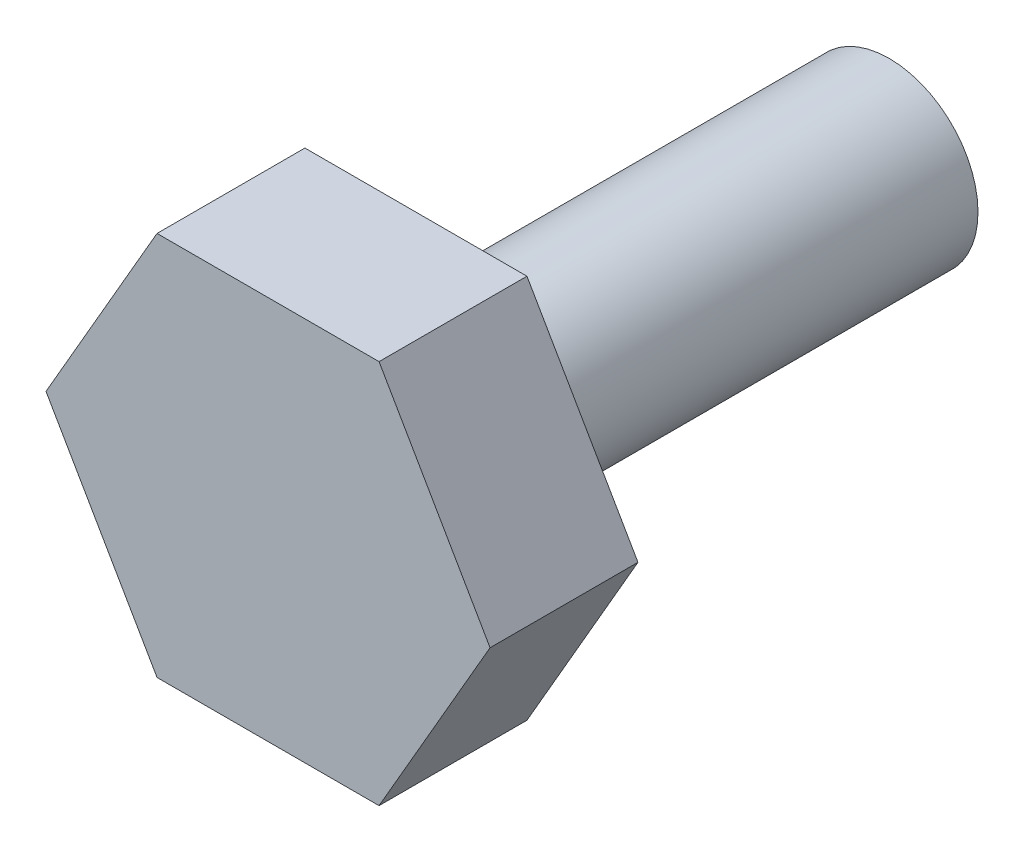
ISO-10303-21;
HEADER;
FILE_DESCRIPTION(('STEP AP214'),'2;1');
FILE_NAME('part.step','',(''),(''),'','','');
FILE_SCHEMA(('AUTOMOTIVE_DESIGN { 1 0 10303 214 1 1 1 1 }'));
ENDSEC;
DATA;
#1=APPLICATION_CONTEXT('core data for automotive mechanical design processes');
#2=APPLICATION_PROTOCOL_DEFINITION('international standard','automotive_design',2000,#1);
#3=PRODUCT_CONTEXT('',#1,'mechanical');
#4=PRODUCT('Part','Part','',(#3));
#5=PRODUCT_RELATED_PRODUCT_CATEGORY('part','',(#4));
#6=PRODUCT_DEFINITION_FORMATION('','',#4);
#7=PRODUCT_DEFINITION_CONTEXT('part definition',#1,'design');
#8=PRODUCT_DEFINITION('design','',#6,#7);
#9=PRODUCT_DEFINITION_SHAPE('','',#8);
#10=(LENGTH_UNIT() NAMED_UNIT(*) SI_UNIT(.MILLI.,.METRE.));
#11=(NAMED_UNIT(*) PLANE_ANGLE_UNIT() SI_UNIT($,.RADIAN.));
#12=(NAMED_UNIT(*) SI_UNIT($,.STERADIAN.) SOLID_ANGLE_UNIT());
#13=UNCERTAINTY_MEASURE_WITH_UNIT(LENGTH_MEASURE(1.E-05),#10,'distance_accuracy_value','');
#14=(GEOMETRIC_REPRESENTATION_CONTEXT(3) GLOBAL_UNCERTAINTY_ASSIGNED_CONTEXT((#13)) GLOBAL_UNIT_ASSIGNED_CONTEXT((#10,
#11,#12)) REPRESENTATION_CONTEXT('',''));
#15=CARTESIAN_POINT('',(0.,0.,0.));
#16=DIRECTION('',(0.,0.,1.));
#17=DIRECTION('',(1.,0.,0.));
#18=AXIS2_PLACEMENT_3D('',#15,#16,#17);
#19=CARTESIAN_POINT('',(-4.76602647216036,-8.255,6.35));
#20=DIRECTION('',(0.,1.,0.));
#21=DIRECTION('',(-1.,0.,0.));
#22=AXIS2_PLACEMENT_3D('',#19,#20,#21);
#23=PLANE('',#22);
#24=DIRECTION('',(1.,0.,0.));
#25=VECTOR('',#24,1.);
#26=CARTESIAN_POINT('',(-4.76602647216036,-8.255,0.));
#27=LINE('',#26,#25);
#28=CARTESIAN_POINT('',(-4.76602647216036,-8.255,0.));
#29=VERTEX_POINT('',#28);
#30=CARTESIAN_POINT('',(4.76602647216036,-8.255,0.));
#31=VERTEX_POINT('',#30);
#32=EDGE_CURVE('E118',#29,#31,#27,.T.);
#33=ORIENTED_EDGE('',*,*,#32,.T.);
#34=DIRECTION('',(0.,0.,-1.));
#35=VECTOR('',#34,1.);
#36=CARTESIAN_POINT('',(4.76602647216036,-8.255,6.35));
#37=LINE('',#36,#35);
#38=CARTESIAN_POINT('',(4.76602647216036,-8.255,6.35));
#39=VERTEX_POINT('',#38);
#40=EDGE_CURVE('E41',#39,#31,#37,.T.);
#41=ORIENTED_EDGE('',*,*,#40,.F.);
#42=DIRECTION('',(1.,0.,0.));
#43=VECTOR('',#42,1.);
#44=CARTESIAN_POINT('',(-4.76602647216036,-8.255,6.35));
#45=LINE('',#44,#43);
#46=CARTESIAN_POINT('',(-4.76602647216036,-8.255,6.35));
#47=VERTEX_POINT('',#46);
#48=EDGE_CURVE('E129',#47,#39,#45,.T.);
#49=ORIENTED_EDGE('',*,*,#48,.F.);
#50=DIRECTION('',(0.,0.,-1.));
#51=VECTOR('',#50,1.);
#52=CARTESIAN_POINT('',(-4.76602647216036,-8.255,6.35));
#53=LINE('',#52,#51);
#54=EDGE_CURVE('E114',#47,#29,#53,.T.);
#55=ORIENTED_EDGE('',*,*,#54,.T.);
#56=EDGE_LOOP('',(#33,#41,#49,#55));
#57=FACE_BOUND('',#56,.T.);
#58=ADVANCED_FACE('F33',(#57),#23,.F.);
#59=CARTESIAN_POINT('',(4.76602647216036,-8.255,6.35));
#60=DIRECTION('',(-0.866025403784439,0.5,0.));
#61=DIRECTION('',(-0.5,-0.866025403784439,0.));
#62=AXIS2_PLACEMENT_3D('',#59,#60,#61);
#63=PLANE('',#62);
#64=DIRECTION('',(0.5,0.866025403784439,0.));
#65=VECTOR('',#64,1.);
#66=CARTESIAN_POINT('',(4.76602647216036,-8.255,0.));
#67=LINE('',#66,#65);
#68=CARTESIAN_POINT('',(9.53205294432072,0.,0.));
#69=VERTEX_POINT('',#68);
#70=EDGE_CURVE('E121',#31,#69,#67,.T.);
#71=ORIENTED_EDGE('',*,*,#70,.T.);
#72=DIRECTION('',(0.,0.,-1.));
#73=VECTOR('',#72,1.);
#74=CARTESIAN_POINT('',(9.53205294432072,0.,6.35));
#75=LINE('',#74,#73);
#76=CARTESIAN_POINT('',(9.53205294432072,0.,6.35));
#77=VERTEX_POINT('',#76);
#78=EDGE_CURVE('E133',#77,#69,#75,.T.);
#79=ORIENTED_EDGE('',*,*,#78,.F.);
#80=DIRECTION('',(0.5,0.866025403784439,0.));
#81=VECTOR('',#80,1.);
#82=CARTESIAN_POINT('',(4.76602647216036,-8.255,6.35));
#83=LINE('',#82,#81);
#84=EDGE_CURVE('E87',#39,#77,#83,.T.);
#85=ORIENTED_EDGE('',*,*,#84,.F.);
#86=ORIENTED_EDGE('',*,*,#40,.T.);
#87=EDGE_LOOP('',(#71,#79,#85,#86));
#88=FACE_BOUND('',#87,.T.);
#89=ADVANCED_FACE('F136',(#88),#63,.F.);
#90=CARTESIAN_POINT('',(9.53205294432072,0.,6.35));
#91=DIRECTION('',(-0.866025403784439,-0.5,0.));
#92=DIRECTION('',(0.5,-0.866025403784439,0.));
#93=AXIS2_PLACEMENT_3D('',#90,#91,#92);
#94=PLANE('',#93);
#95=DIRECTION('',(-0.5,0.866025403784439,0.));
#96=VECTOR('',#95,1.);
#97=CARTESIAN_POINT('',(9.53205294432072,0.,0.));
#98=LINE('',#97,#96);
#99=CARTESIAN_POINT('',(4.76602647216036,8.255,0.));
#100=VERTEX_POINT('',#99);
#101=EDGE_CURVE('E124',#69,#100,#98,.T.);
#102=ORIENTED_EDGE('',*,*,#101,.T.);
#103=DIRECTION('',(0.,0.,-1.));
#104=VECTOR('',#103,1.);
#105=CARTESIAN_POINT('',(4.76602647216036,8.255,6.35));
#106=LINE('',#105,#104);
#107=CARTESIAN_POINT('',(4.76602647216036,8.255,6.35));
#108=VERTEX_POINT('',#107);
#109=EDGE_CURVE('E109',#108,#100,#106,.T.);
#110=ORIENTED_EDGE('',*,*,#109,.F.);
#111=DIRECTION('',(-0.5,0.866025403784439,0.));
#112=VECTOR('',#111,1.);
#113=CARTESIAN_POINT('',(9.53205294432072,0.,6.35));
#114=LINE('',#113,#112);
#115=EDGE_CURVE('E100',#77,#108,#114,.T.);
#116=ORIENTED_EDGE('',*,*,#115,.F.);
#117=ORIENTED_EDGE('',*,*,#78,.T.);
#118=EDGE_LOOP('',(#102,#110,#116,#117));
#119=FACE_BOUND('',#118,.T.);
#120=ADVANCED_FACE('F144',(#119),#94,.F.);
#121=CARTESIAN_POINT('',(4.76602647216036,8.255,6.35));
#122=DIRECTION('',(0.,-1.,0.));
#123=DIRECTION('',(0.,0.,-1.));
#124=AXIS2_PLACEMENT_3D('',#121,#122,#123);
#125=PLANE('',#124);
#126=DIRECTION('',(-1.,0.,0.));
#127=VECTOR('',#126,1.);
#128=CARTESIAN_POINT('',(4.76602647216036,8.255,0.));
#129=LINE('',#128,#127);
#130=CARTESIAN_POINT('',(-4.76602647216036,8.255,0.));
#131=VERTEX_POINT('',#130);
#132=EDGE_CURVE('E108',#100,#131,#129,.T.);
#133=ORIENTED_EDGE('',*,*,#132,.T.);
#134=DIRECTION('',(0.,0.,-1.));
#135=VECTOR('',#134,1.);
#136=CARTESIAN_POINT('',(-4.76602647216036,8.255,6.35));
#137=LINE('',#136,#135);
#138=CARTESIAN_POINT('',(-4.76602647216036,8.255,6.35));
#139=VERTEX_POINT('',#138);
#140=EDGE_CURVE('E105',#139,#131,#137,.T.);
#141=ORIENTED_EDGE('',*,*,#140,.F.);
#142=DIRECTION('',(-1.,0.,0.));
#143=VECTOR('',#142,1.);
#144=CARTESIAN_POINT('',(4.76602647216036,8.255,6.35));
#145=LINE('',#144,#143);
#146=EDGE_CURVE('E94',#108,#139,#145,.T.);
#147=ORIENTED_EDGE('',*,*,#146,.F.);
#148=ORIENTED_EDGE('',*,*,#109,.T.);
#149=EDGE_LOOP('',(#133,#141,#147,#148));
#150=FACE_BOUND('',#149,.T.);
#151=ADVANCED_FACE('F106',(#150),#125,.F.);
#152=CARTESIAN_POINT('',(-4.76602647216036,8.255,6.35));
#153=DIRECTION('',(0.866025403784439,-0.5,0.));
#154=DIRECTION('',(0.5,0.866025403784439,0.));
#155=AXIS2_PLACEMENT_3D('',#152,#153,#154);
#156=PLANE('',#155);
#157=DIRECTION('',(-0.5,-0.866025403784439,0.));
#158=VECTOR('',#157,1.);
#159=CARTESIAN_POINT('',(-4.76602647216036,8.255,0.));
#160=LINE('',#159,#158);
#161=CARTESIAN_POINT('',(-9.53205294432072,0.,0.));
#162=VERTEX_POINT('',#161);
#163=EDGE_CURVE('E72',#131,#162,#160,.T.);
#164=ORIENTED_EDGE('',*,*,#163,.T.);
#165=DIRECTION('',(0.,0.,-1.));
#166=VECTOR('',#165,1.);
#167=CARTESIAN_POINT('',(-9.53205294432072,0.,6.35));
#168=LINE('',#167,#166);
#169=CARTESIAN_POINT('',(-9.53205294432072,0.,6.35));
#170=VERTEX_POINT('',#169);
#171=EDGE_CURVE('E110',#170,#162,#168,.T.);
#172=ORIENTED_EDGE('',*,*,#171,.F.);
#173=DIRECTION('',(-0.5,-0.866025403784439,0.));
#174=VECTOR('',#173,1.);
#175=CARTESIAN_POINT('',(-4.76602647216036,8.255,6.35));
#176=LINE('',#175,#174);
#177=EDGE_CURVE('E98',#139,#170,#176,.T.);
#178=ORIENTED_EDGE('',*,*,#177,.F.);
#179=ORIENTED_EDGE('',*,*,#140,.T.);
#180=EDGE_LOOP('',(#164,#172,#178,#179));
#181=FACE_BOUND('',#180,.T.);
#182=ADVANCED_FACE('F112',(#181),#156,.F.);
#183=CARTESIAN_POINT('',(-9.53205294432072,0.,6.35));
#184=DIRECTION('',(0.866025403784439,0.5,0.));
#185=DIRECTION('',(-0.5,0.866025403784439,0.));
#186=AXIS2_PLACEMENT_3D('',#183,#184,#185);
#187=PLANE('',#186);
#188=DIRECTION('',(0.5,-0.866025403784439,0.));
#189=VECTOR('',#188,1.);
#190=CARTESIAN_POINT('',(-9.53205294432072,0.,0.));
#191=LINE('',#190,#189);
#192=EDGE_CURVE('E78',#162,#29,#191,.T.);
#193=ORIENTED_EDGE('',*,*,#192,.T.);
#194=ORIENTED_EDGE('',*,*,#54,.F.);
#195=DIRECTION('',(0.5,-0.866025403784439,0.));
#196=VECTOR('',#195,1.);
#197=CARTESIAN_POINT('',(-9.53205294432072,0.,6.35));
#198=LINE('',#197,#196);
#199=EDGE_CURVE('E49',#170,#47,#198,.T.);
#200=ORIENTED_EDGE('',*,*,#199,.F.);
#201=ORIENTED_EDGE('',*,*,#171,.T.);
#202=EDGE_LOOP('',(#193,#194,#200,#201));
#203=FACE_BOUND('',#202,.T.);
#204=ADVANCED_FACE('F164',(#203),#187,.F.);
#205=CARTESIAN_POINT('',(0.,0.,6.35));
#206=DIRECTION('',(0.,0.,1.));
#207=DIRECTION('',(1.,0.,0.));
#208=AXIS2_PLACEMENT_3D('',#205,#206,#207);
#209=PLANE('',#208);
#210=ORIENTED_EDGE('',*,*,#48,.T.);
#211=ORIENTED_EDGE('',*,*,#84,.T.);
#212=ORIENTED_EDGE('',*,*,#115,.T.);
#213=ORIENTED_EDGE('',*,*,#146,.T.);
#214=ORIENTED_EDGE('',*,*,#177,.T.);
#215=ORIENTED_EDGE('',*,*,#199,.T.);
#216=EDGE_LOOP('',(#210,#211,#212,#213,#214,#215));
#217=FACE_BOUND('',#216,.T.);
#218=ADVANCED_FACE('F96',(#217),#209,.T.);
#219=CARTESIAN_POINT('',(0.,0.,0.));
#220=DIRECTION('',(0.,0.,1.));
#221=DIRECTION('',(1.,0.,0.));
#222=AXIS2_PLACEMENT_3D('',#219,#220,#221);
#223=PLANE('',#222);
#224=CARTESIAN_POINT('',(0.,0.,0.));
#225=DIRECTION('',(0.,0.,1.));
#226=DIRECTION('',(1.,0.,0.));
#227=AXIS2_PLACEMENT_3D('',#224,#225,#226);
#228=CIRCLE('',#227,3.81);
#229=CARTESIAN_POINT('',(3.81,0.,0.));
#230=VERTEX_POINT('',#229);
#231=EDGE_CURVE('E11',#230,#230,#228,.F.);
#232=ORIENTED_EDGE('',*,*,#231,.F.);
#233=EDGE_LOOP('',(#232));
#234=FACE_BOUND('',#233,.T.);
#235=ORIENTED_EDGE('',*,*,#32,.F.);
#236=ORIENTED_EDGE('',*,*,#192,.F.);
#237=ORIENTED_EDGE('',*,*,#163,.F.);
#238=ORIENTED_EDGE('',*,*,#132,.F.);
#239=ORIENTED_EDGE('',*,*,#101,.F.);
#240=ORIENTED_EDGE('',*,*,#70,.F.);
#241=EDGE_LOOP('',(#235,#236,#237,#238,#239,#240));
#242=FACE_BOUND('',#241,.T.);
#243=ADVANCED_FACE('F141',(#234,#242),#223,.F.);
#244=CARTESIAN_POINT('',(0.,0.,-20.32));
#245=DIRECTION('',(0.,0.,1.));
#246=DIRECTION('',(1.,0.,0.));
#247=AXIS2_PLACEMENT_3D('',#244,#245,#246);
#248=CYLINDRICAL_SURFACE('',#247,3.81);
#249=CARTESIAN_POINT('',(0.,0.,-20.32));
#250=DIRECTION('',(0.,0.,-1.));
#251=DIRECTION('',(-1.,0.,0.));
#252=AXIS2_PLACEMENT_3D('',#249,#250,#251);
#253=CIRCLE('',#252,3.81);
#254=CARTESIAN_POINT('',(-3.81,0.,-20.32));
#255=VERTEX_POINT('',#254);
#256=EDGE_CURVE('E122',#255,#255,#253,.T.);
#257=ORIENTED_EDGE('',*,*,#256,.F.);
#258=EDGE_LOOP('',(#257));
#259=FACE_BOUND('',#258,.T.);
#260=ORIENTED_EDGE('',*,*,#231,.T.);
#261=EDGE_LOOP('',(#260));
#262=FACE_BOUND('',#261,.T.);
#263=ADVANCED_FACE('F153',(#259,#262),#248,.T.);
#264=CARTESIAN_POINT('',(0.,0.,-20.32));
#265=DIRECTION('',(0.,0.,-1.));
#266=DIRECTION('',(-1.,0.,0.));
#267=AXIS2_PLACEMENT_3D('',#264,#265,#266);
#268=PLANE('',#267);
#269=ORIENTED_EDGE('',*,*,#256,.T.);
#270=EDGE_LOOP('',(#269));
#271=FACE_BOUND('',#270,.T.);
#272=ADVANCED_FACE('F151',(#271),#268,.T.);
#273=CLOSED_SHELL('',(#58,#89,#120,#151,#182,#204,#218,#243,#263,#272));
#274=MANIFOLD_SOLID_BREP('B2',#273);
#275=ADVANCED_BREP_SHAPE_REPRESENTATION('',(#18,#274),#14);
#276=SHAPE_DEFINITION_REPRESENTATION(#9,#275);
ENDSEC;
END-ISO-10303-21;
